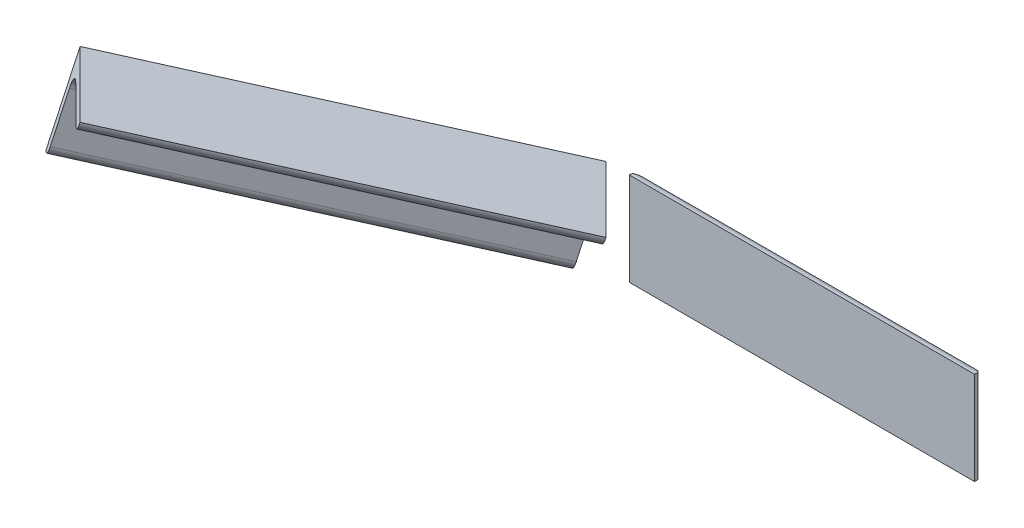
ISO-10303-21;
HEADER;
FILE_DESCRIPTION(('STEP AP214'),'2;1');
FILE_NAME('part.step','',(''),(''),'','','');
FILE_SCHEMA(('AUTOMOTIVE_DESIGN { 1 0 10303 214 1 1 1 1 }'));
ENDSEC;
DATA;
#1=APPLICATION_CONTEXT('core data for automotive mechanical design processes');
#2=APPLICATION_PROTOCOL_DEFINITION('international standard','automotive_design',2000,#1);
#3=PRODUCT_CONTEXT('',#1,'mechanical');
#4=PRODUCT('Part','Part','',(#3));
#5=PRODUCT_RELATED_PRODUCT_CATEGORY('part','',(#4));
#6=PRODUCT_DEFINITION_FORMATION('','',#4);
#7=PRODUCT_DEFINITION_CONTEXT('part definition',#1,'design');
#8=PRODUCT_DEFINITION('design','',#6,#7);
#9=PRODUCT_DEFINITION_SHAPE('','',#8);
#10=(LENGTH_UNIT() NAMED_UNIT(*) SI_UNIT(.MILLI.,.METRE.));
#11=(NAMED_UNIT(*) PLANE_ANGLE_UNIT() SI_UNIT($,.RADIAN.));
#12=(NAMED_UNIT(*) SI_UNIT($,.STERADIAN.) SOLID_ANGLE_UNIT());
#13=UNCERTAINTY_MEASURE_WITH_UNIT(LENGTH_MEASURE(1.E-05),#10,'distance_accuracy_value','');
#14=(GEOMETRIC_REPRESENTATION_CONTEXT(3) GLOBAL_UNCERTAINTY_ASSIGNED_CONTEXT((#13)) GLOBAL_UNIT_ASSIGNED_CONTEXT((#10,
#11,#12)) REPRESENTATION_CONTEXT('',''));
#15=CARTESIAN_POINT('',(0.,0.,0.));
#16=DIRECTION('',(0.,0.,1.));
#17=DIRECTION('',(1.,0.,0.));
#18=AXIS2_PLACEMENT_3D('',#15,#16,#17);
#19=CARTESIAN_POINT('',(-76.4905715966155,28.0891219632598,76.4905715966157));
#20=DIRECTION('',(0.707106781186549,0.,0.707106781186546));
#21=DIRECTION('',(0.707106781186546,0.,-0.707106781186549));
#22=AXIS2_PLACEMENT_3D('',#19,#20,#21);
#23=PLANE('',#22);
#24=DIRECTION('',(-0.183012701892219,-0.965925826289068,0.18301270189222));
#25=VECTOR('',#24,1.);
#26=CARTESIAN_POINT('',(-4.64852262806237,0.865484012257667,4.64852262806239));
#27=LINE('',#26,#25);
#28=CARTESIAN_POINT('',(0.,25.4,0.));
#29=VERTEX_POINT('',#28);
#30=CARTESIAN_POINT('',(-4.64852262806237,0.865484012257667,4.64852262806239));
#31=VERTEX_POINT('',#30);
#32=EDGE_CURVE('E205',#29,#31,#27,.T.);
#33=ORIENTED_EDGE('',*,*,#32,.T.);
#34=DIRECTION('',(0.683012701892218,-0.258819045102521,-0.683012701892221));
#35=VECTOR('',#34,1.);
#36=CARTESIAN_POINT('',(-76.4905715966155,28.0891219632598,76.4905715966157));
#37=LINE('',#36,#35);
#38=CARTESIAN_POINT('',(-76.4905715966155,28.0891219632598,76.4905715966157));
#39=VERTEX_POINT('',#38);
#40=EDGE_CURVE('E14',#39,#31,#37,.T.);
#41=ORIENTED_EDGE('',*,*,#40,.F.);
#42=DIRECTION('',(-0.183012701892219,-0.965925826289068,0.18301270189222));
#43=VECTOR('',#42,1.);
#44=CARTESIAN_POINT('',(-76.4905715966155,28.0891219632598,76.4905715966157));
#45=LINE('',#44,#43);
#46=CARTESIAN_POINT('',(-71.8420489685531,52.6236379510021,71.8420489685534));
#47=VERTEX_POINT('',#46);
#48=EDGE_CURVE('E221',#47,#39,#45,.T.);
#49=ORIENTED_EDGE('',*,*,#48,.F.);
#50=DIRECTION('',(0.683012701892218,-0.258819045102521,-0.683012701892221));
#51=VECTOR('',#50,1.);
#52=CARTESIAN_POINT('',(-71.8420489685531,52.6236379510021,71.8420489685534));
#53=LINE('',#52,#51);
#54=EDGE_CURVE('E201',#47,#29,#53,.T.);
#55=ORIENTED_EDGE('',*,*,#54,.T.);
#56=EDGE_LOOP('',(#33,#41,#49,#55));
#57=FACE_BOUND('',#56,.T.);
#58=ADVANCED_FACE('F103',(#57),#23,.F.);
#59=CARTESIAN_POINT('',(-76.486979494167,28.0891219632598,76.4941636990642));
#60=DIRECTION('',(0.18301270189222,0.965925826289068,-0.18301270189222));
#61=DIRECTION('',(0.,0.186156787897386,0.982520050848698));
#62=AXIS2_PLACEMENT_3D('',#59,#60,#61);
#63=PLANE('',#62);
#64=DIRECTION('',(0.707106781186548,0.,0.707106781186548));
#65=VECTOR('',#64,1.);
#66=CARTESIAN_POINT('',(-4.64493052561394,0.865484012257667,4.65211473051081));
#67=LINE('',#66,#65);
#68=CARTESIAN_POINT('',(-4.64493052561394,0.865484012257669,4.65211473051081));
#69=VERTEX_POINT('',#68);
#70=EDGE_CURVE('E208',#31,#69,#67,.T.);
#71=ORIENTED_EDGE('',*,*,#70,.T.);
#72=DIRECTION('',(0.683012701892218,-0.258819045102521,-0.683012701892221));
#73=VECTOR('',#72,1.);
#74=CARTESIAN_POINT('',(-76.486979494167,28.0891219632598,76.4941636990642));
#75=LINE('',#74,#73);
#76=CARTESIAN_POINT('',(-76.486979494167,28.0891219632598,76.4941636990642));
#77=VERTEX_POINT('',#76);
#78=EDGE_CURVE('E111',#77,#69,#75,.T.);
#79=ORIENTED_EDGE('',*,*,#78,.F.);
#80=DIRECTION('',(0.707106781186548,0.,0.707106781186548));
#81=VECTOR('',#80,1.);
#82=CARTESIAN_POINT('',(-76.486979494167,28.0891219632598,76.4941636990642));
#83=LINE('',#82,#81);
#84=EDGE_CURVE('E165',#39,#77,#83,.T.);
#85=ORIENTED_EDGE('',*,*,#84,.F.);
#86=ORIENTED_EDGE('',*,*,#40,.T.);
#87=EDGE_LOOP('',(#71,#79,#85,#86));
#88=FACE_BOUND('',#87,.T.);
#89=ADVANCED_FACE('F264',(#88),#63,.F.);
#90=CARTESIAN_POINT('',(-75.9068438701849,31.15102955853,75.914028075082));
#91=DIRECTION('',(0.683012701892218,-0.258819045102521,-0.683012701892221));
#92=DIRECTION('',(-0.707106781186549,0.,-0.707106781186546));
#93=AXIS2_PLACEMENT_3D('',#90,#91,#92);
#94=CYLINDRICAL_SURFACE('',#93,3.16992);
#95=CARTESIAN_POINT('',(-4.06479490163176,3.92739160752791,4.07197910652863));
#96=DIRECTION('',(-0.683012701892218,0.258819045102521,0.683012701892221));
#97=DIRECTION('',(0.707106781186549,0.,0.707106781186546));
#98=AXIS2_PLACEMENT_3D('',#95,#96,#97);
#99=CIRCLE('',#98,3.16992);
#100=CARTESIAN_POINT('',(-1.8233229738129,3.92739160752791,6.31345103434748));
#101=VERTEX_POINT('',#100);
#102=EDGE_CURVE('E210',#69,#101,#99,.T.);
#103=ORIENTED_EDGE('',*,*,#102,.T.);
#104=DIRECTION('',(0.683012701892218,-0.258819045102521,-0.683012701892221));
#105=VECTOR('',#104,1.);
#106=CARTESIAN_POINT('',(-73.665371942366,31.15102955853,78.1555000029008));
#107=LINE('',#106,#105);
#108=CARTESIAN_POINT('',(-73.665371942366,31.15102955853,78.1555000029008));
#109=VERTEX_POINT('',#108);
#110=EDGE_CURVE('E231',#109,#101,#107,.T.);
#111=ORIENTED_EDGE('',*,*,#110,.F.);
#112=CARTESIAN_POINT('',(-75.9068438701849,31.15102955853,75.914028075082));
#113=DIRECTION('',(-0.683012701892218,0.258819045102521,0.683012701892221));
#114=DIRECTION('',(0.707106781186549,0.,0.707106781186546));
#115=AXIS2_PLACEMENT_3D('',#112,#113,#114);
#116=CIRCLE('',#115,3.16992);
#117=EDGE_CURVE('E239',#77,#109,#116,.T.);
#118=ORIENTED_EDGE('',*,*,#117,.F.);
#119=ORIENTED_EDGE('',*,*,#78,.T.);
#120=EDGE_LOOP('',(#103,#111,#118,#119));
#121=FACE_BOUND('',#120,.T.);
#122=ADVANCED_FACE('F237',(#121),#94,.T.);
#123=CARTESIAN_POINT('',(-71.0496482595553,44.9566017048326,75.5397763200901));
#124=DIRECTION('',(-0.707106781186549,0.,-0.707106781186546));
#125=DIRECTION('',(-0.707106781186546,0.,0.707106781186549));
#126=AXIS2_PLACEMENT_3D('',#123,#124,#125);
#127=PLANE('',#126);
#128=DIRECTION('',(0.183012701892219,0.965925826289068,-0.18301270189222));
#129=VECTOR('',#128,1.);
#130=CARTESIAN_POINT('',(0.792400708997793,17.7329637538305,3.69772735153678));
#131=LINE('',#130,#129);
#132=CARTESIAN_POINT('',(0.792400708997794,17.7329637538305,3.69772735153678));
#133=VERTEX_POINT('',#132);
#134=EDGE_CURVE('E212',#101,#133,#131,.T.);
#135=ORIENTED_EDGE('',*,*,#134,.T.);
#136=DIRECTION('',(0.683012701892218,-0.258819045102521,-0.683012701892221));
#137=VECTOR('',#136,1.);
#138=CARTESIAN_POINT('',(-71.0496482595553,44.9566017048326,75.5397763200901));
#139=LINE('',#138,#137);
#140=CARTESIAN_POINT('',(-71.0496482595553,44.9566017048326,75.5397763200901));
#141=VERTEX_POINT('',#140);
#142=EDGE_CURVE('E228',#141,#133,#139,.T.);
#143=ORIENTED_EDGE('',*,*,#142,.F.);
#144=DIRECTION('',(0.183012701892219,0.965925826289068,-0.18301270189222));
#145=VECTOR('',#144,1.);
#146=CARTESIAN_POINT('',(-71.0496482595553,44.9566017048326,75.5397763200901));
#147=LINE('',#146,#145);
#148=EDGE_CURVE('E255',#109,#141,#147,.T.);
#149=ORIENTED_EDGE('',*,*,#148,.F.);
#150=ORIENTED_EDGE('',*,*,#110,.T.);
#151=EDGE_LOOP('',(#135,#143,#149,#150));
#152=FACE_BOUND('',#151,.T.);
#153=ADVANCED_FACE('F248',(#152),#127,.F.);
#154=CARTESIAN_POINT('',(-67.6820522141544,44.9566017048326,78.9073723654911));
#155=DIRECTION('',(0.683012701892218,-0.258819045102521,-0.683012701892221));
#156=DIRECTION('',(-0.707106781186549,0.,-0.707106781186546));
#157=AXIS2_PLACEMENT_3D('',#154,#155,#156);
#158=CYLINDRICAL_SURFACE('',#157,4.7625);
#159=CARTESIAN_POINT('',(4.15999675439873,17.7329637538305,7.06532339693771));
#160=DIRECTION('',(0.683012701892218,-0.258819045102521,-0.683012701892221));
#161=DIRECTION('',(-0.707106781186549,0.,-0.707106781186546));
#162=AXIS2_PLACEMENT_3D('',#159,#160,#161);
#163=CIRCLE('',#162,4.7625);
#164=CARTESIAN_POINT('',(5.03159474716043,22.3331855015322,6.19372540417601));
#165=VERTEX_POINT('',#164);
#166=EDGE_CURVE('E214',#133,#165,#163,.T.);
#167=ORIENTED_EDGE('',*,*,#166,.T.);
#168=DIRECTION('',(0.683012701892218,-0.258819045102521,-0.683012701892221));
#169=VECTOR('',#168,1.);
#170=CARTESIAN_POINT('',(-66.8104542213927,49.5568234525343,78.0357743727294));
#171=LINE('',#170,#169);
#172=CARTESIAN_POINT('',(-66.8104542213927,49.5568234525343,78.0357743727294));
#173=VERTEX_POINT('',#172);
#174=EDGE_CURVE('E225',#173,#165,#171,.T.);
#175=ORIENTED_EDGE('',*,*,#174,.F.);
#176=CARTESIAN_POINT('',(-67.6820522141544,44.9566017048326,78.9073723654911));
#177=DIRECTION('',(0.683012701892218,-0.258819045102521,-0.683012701892221));
#178=DIRECTION('',(-0.707106781186549,0.,-0.707106781186546));
#179=AXIS2_PLACEMENT_3D('',#176,#177,#178);
#180=CIRCLE('',#179,4.7625);
#181=EDGE_CURVE('E254',#141,#173,#180,.T.);
#182=ORIENTED_EDGE('',*,*,#181,.F.);
#183=ORIENTED_EDGE('',*,*,#142,.T.);
#184=EDGE_LOOP('',(#167,#175,#182,#183));
#185=FACE_BOUND('',#184,.T.);
#186=ADVANCED_FACE('F252',(#185),#158,.F.);
#187=CARTESIAN_POINT('',(-56.7040739827414,49.5568234525343,88.1421546113806));
#188=DIRECTION('',(0.183012701892218,0.965925826289068,-0.183012701892221));
#189=DIRECTION('',(0.,0.186156787897387,0.982520050848697));
#190=AXIS2_PLACEMENT_3D('',#187,#188,#189);
#191=PLANE('',#190);
#192=DIRECTION('',(0.707106781186549,0.,0.707106781186546));
#193=VECTOR('',#192,1.);
#194=CARTESIAN_POINT('',(15.1379749858117,22.3331855015322,16.3001056428272));
#195=LINE('',#194,#193);
#196=CARTESIAN_POINT('',(15.1379749858117,22.3331855015322,16.3001056428272));
#197=VERTEX_POINT('',#196);
#198=EDGE_CURVE('E216',#165,#197,#195,.T.);
#199=ORIENTED_EDGE('',*,*,#198,.T.);
#200=DIRECTION('',(0.683012701892218,-0.258819045102521,-0.683012701892221));
#201=VECTOR('',#200,1.);
#202=CARTESIAN_POINT('',(-56.7040739827414,49.5568234525343,88.1421546113806));
#203=LINE('',#202,#201);
#204=CARTESIAN_POINT('',(-56.7040739827414,49.5568234525343,88.1421546113806));
#205=VERTEX_POINT('',#204);
#206=EDGE_CURVE('E196',#205,#197,#203,.T.);
#207=ORIENTED_EDGE('',*,*,#206,.F.);
#208=DIRECTION('',(0.707106781186549,0.,0.707106781186546));
#209=VECTOR('',#208,1.);
#210=CARTESIAN_POINT('',(-56.7040739827414,49.5568234525343,88.1421546113806));
#211=LINE('',#210,#209);
#212=EDGE_CURVE('E187',#173,#205,#211,.T.);
#213=ORIENTED_EDGE('',*,*,#212,.F.);
#214=ORIENTED_EDGE('',*,*,#174,.T.);
#215=EDGE_LOOP('',(#199,#207,#213,#214));
#216=FACE_BOUND('',#215,.T.);
#217=ADVANCED_FACE('F276',(#216),#191,.F.);
#218=CARTESIAN_POINT('',(-56.1239383587592,52.6187310478046,87.5620189873984));
#219=DIRECTION('',(0.683012701892218,-0.258819045102521,-0.683012701892221));
#220=DIRECTION('',(-0.707106781186549,0.,-0.707106781186546));
#221=AXIS2_PLACEMENT_3D('',#218,#219,#220);
#222=CYLINDRICAL_SURFACE('',#221,3.16991999999999);
#223=CARTESIAN_POINT('',(15.7181106097939,25.3950930968025,15.719970018845));
#224=DIRECTION('',(-0.683012701892218,0.258819045102521,0.683012701892221));
#225=DIRECTION('',(-0.707106781186549,0.,-0.707106781186546));
#226=AXIS2_PLACEMENT_3D('',#223,#224,#225);
#227=CIRCLE('',#226,3.16991999999999);
#228=CARTESIAN_POINT('',(17.9595825376127,25.3950930968025,17.9614419466639));
#229=VERTEX_POINT('',#228);
#230=EDGE_CURVE('E195',#197,#229,#227,.T.);
#231=ORIENTED_EDGE('',*,*,#230,.T.);
#232=DIRECTION('',(0.683012701892218,-0.258819045102521,-0.683012701892221));
#233=VECTOR('',#232,1.);
#234=CARTESIAN_POINT('',(-53.8824664309404,52.6187310478046,89.8034909152173));
#235=LINE('',#234,#233);
#236=CARTESIAN_POINT('',(-53.8824664309404,52.6187310478046,89.8034909152173));
#237=VERTEX_POINT('',#236);
#238=EDGE_CURVE('E192',#237,#229,#235,.T.);
#239=ORIENTED_EDGE('',*,*,#238,.F.);
#240=CARTESIAN_POINT('',(-56.1239383587592,52.6187310478046,87.5620189873984));
#241=DIRECTION('',(-0.683012701892218,0.258819045102521,0.683012701892221));
#242=DIRECTION('',(-0.707106781186549,0.,-0.707106781186546));
#243=AXIS2_PLACEMENT_3D('',#240,#241,#242);
#244=CIRCLE('',#243,3.16991999999999);
#245=EDGE_CURVE('E181',#205,#237,#244,.T.);
#246=ORIENTED_EDGE('',*,*,#245,.F.);
#247=ORIENTED_EDGE('',*,*,#206,.T.);
#248=EDGE_LOOP('',(#231,#239,#246,#247));
#249=FACE_BOUND('',#248,.T.);
#250=ADVANCED_FACE('F193',(#249),#222,.T.);
#251=CARTESIAN_POINT('',(-53.8815367264148,52.6236379510021,89.8025612106916));
#252=DIRECTION('',(-0.707106781186549,0.,-0.707106781186546));
#253=DIRECTION('',(-0.707106781186546,0.,0.707106781186549));
#254=AXIS2_PLACEMENT_3D('',#251,#252,#253);
#255=PLANE('',#254);
#256=DIRECTION('',(0.183012701892123,0.965925826289104,-0.183012701892123));
#257=VECTOR('',#256,1.);
#258=CARTESIAN_POINT('',(17.9605122421383,25.4,17.9605122421383));
#259=LINE('',#258,#257);
#260=CARTESIAN_POINT('',(17.9605122421383,25.4,17.9605122421383));
#261=VERTEX_POINT('',#260);
#262=EDGE_CURVE('E151',#229,#261,#259,.T.);
#263=ORIENTED_EDGE('',*,*,#262,.T.);
#264=DIRECTION('',(0.683012701892218,-0.258819045102521,-0.683012701892221));
#265=VECTOR('',#264,1.);
#266=CARTESIAN_POINT('',(-53.8815367264148,52.6236379510021,89.8025612106916));
#267=LINE('',#266,#265);
#268=CARTESIAN_POINT('',(-53.8815367264148,52.6236379510021,89.8025612106916));
#269=VERTEX_POINT('',#268);
#270=EDGE_CURVE('E197',#269,#261,#267,.T.);
#271=ORIENTED_EDGE('',*,*,#270,.F.);
#272=DIRECTION('',(0.183012701892123,0.965925826289104,-0.183012701892123));
#273=VECTOR('',#272,1.);
#274=CARTESIAN_POINT('',(-53.8815367264148,52.6236379510021,89.8025612106916));
#275=LINE('',#274,#273);
#276=EDGE_CURVE('E185',#237,#269,#275,.T.);
#277=ORIENTED_EDGE('',*,*,#276,.F.);
#278=ORIENTED_EDGE('',*,*,#238,.T.);
#279=EDGE_LOOP('',(#263,#271,#277,#278));
#280=FACE_BOUND('',#279,.T.);
#281=ADVANCED_FACE('F199',(#280),#255,.F.);
#282=CARTESIAN_POINT('',(-71.8420489685531,52.6236379510021,71.8420489685534));
#283=DIRECTION('',(-0.183012701892219,-0.965925826289068,0.18301270189222));
#284=DIRECTION('',(0.,-0.186156787897386,-0.982520050848698));
#285=AXIS2_PLACEMENT_3D('',#282,#283,#284);
#286=PLANE('',#285);
#287=DIRECTION('',(-0.707106781186549,0.,-0.707106781186546));
#288=VECTOR('',#287,1.);
#289=CARTESIAN_POINT('',(0.,25.4,0.));
#290=LINE('',#289,#288);
#291=EDGE_CURVE('E157',#261,#29,#290,.T.);
#292=ORIENTED_EDGE('',*,*,#291,.T.);
#293=ORIENTED_EDGE('',*,*,#54,.F.);
#294=DIRECTION('',(-0.707106781186549,0.,-0.707106781186546));
#295=VECTOR('',#294,1.);
#296=CARTESIAN_POINT('',(-71.8420489685531,52.6236379510021,71.8420489685534));
#297=LINE('',#296,#295);
#298=EDGE_CURVE('E119',#269,#47,#297,.T.);
#299=ORIENTED_EDGE('',*,*,#298,.F.);
#300=ORIENTED_EDGE('',*,*,#270,.T.);
#301=EDGE_LOOP('',(#292,#293,#299,#300));
#302=FACE_BOUND('',#301,.T.);
#303=ADVANCED_FACE('F284',(#302),#286,.F.);
#304=CARTESIAN_POINT('',(-56.1239383587592,52.6187310478046,87.5620189873984));
#305=DIRECTION('',(0.683012701892218,-0.258819045102521,-0.683012701892221));
#306=DIRECTION('',(-0.707106781186549,0.,-0.707106781186546));
#307=AXIS2_PLACEMENT_3D('',#304,#305,#306);
#308=PLANE('',#307);
#309=ORIENTED_EDGE('',*,*,#48,.T.);
#310=ORIENTED_EDGE('',*,*,#84,.T.);
#311=ORIENTED_EDGE('',*,*,#117,.T.);
#312=ORIENTED_EDGE('',*,*,#148,.T.);
#313=ORIENTED_EDGE('',*,*,#181,.T.);
#314=ORIENTED_EDGE('',*,*,#212,.T.);
#315=ORIENTED_EDGE('',*,*,#245,.T.);
#316=ORIENTED_EDGE('',*,*,#276,.T.);
#317=ORIENTED_EDGE('',*,*,#298,.T.);
#318=EDGE_LOOP('',(#309,#310,#311,#312,#313,#314,#315,#316,#317));
#319=FACE_BOUND('',#318,.T.);
#320=ADVANCED_FACE('F183',(#319),#308,.F.);
#321=CARTESIAN_POINT('',(15.7181106097939,25.3950930968025,15.719970018845));
#322=DIRECTION('',(0.683012701892218,-0.258819045102521,-0.683012701892221));
#323=DIRECTION('',(-0.707106781186549,0.,-0.707106781186546));
#324=AXIS2_PLACEMENT_3D('',#321,#322,#323);
#325=PLANE('',#324);
#326=ORIENTED_EDGE('',*,*,#32,.F.);
#327=ORIENTED_EDGE('',*,*,#291,.F.);
#328=ORIENTED_EDGE('',*,*,#262,.F.);
#329=ORIENTED_EDGE('',*,*,#230,.F.);
#330=ORIENTED_EDGE('',*,*,#198,.F.);
#331=ORIENTED_EDGE('',*,*,#166,.F.);
#332=ORIENTED_EDGE('',*,*,#134,.F.);
#333=ORIENTED_EDGE('',*,*,#102,.F.);
#334=ORIENTED_EDGE('',*,*,#70,.F.);
#335=EDGE_LOOP('',(#326,#327,#328,#329,#330,#331,#332,#333,#334));
#336=FACE_BOUND('',#335,.T.);
#337=ADVANCED_FACE('F243',(#336),#325,.T.);
#338=CLOSED_SHELL('',(#58,#89,#122,#153,#186,#217,#250,#281,#303,#320,#337));
#339=MANIFOLD_SOLID_BREP('B2',#338);
#340=CARTESIAN_POINT('',(100.642689271226,0.,-25.4));
#341=DIRECTION('',(0.,1.,0.));
#342=DIRECTION('',(0.,0.,1.));
#343=AXIS2_PLACEMENT_3D('',#340,#341,#342);
#344=PLANE('',#343);
#345=DIRECTION('',(-1.,0.,0.));
#346=VECTOR('',#345,1.);
#347=CARTESIAN_POINT('',(100.642689271226,0.,-25.4));
#348=LINE('',#347,#346);
#349=CARTESIAN_POINT('',(76.2045355985849,0.,-25.4));
#350=VERTEX_POINT('',#349);
#351=CARTESIAN_POINT('',(30.7881536726414,0.,-25.4));
#352=VERTEX_POINT('',#351);
#353=EDGE_CURVE('E473',#350,#352,#348,.T.);
#354=ORIENTED_EDGE('',*,*,#353,.F.);
#355=DIRECTION('',(-0.707106781186546,0.,-0.707106781186549));
#356=VECTOR('',#355,1.);
#357=CARTESIAN_POINT('',(104.298612434906,0.,2.69407683632074));
#358=LINE('',#357,#356);
#359=CARTESIAN_POINT('',(100.642689271226,0.,-0.961846327358522));
#360=VERTEX_POINT('',#359);
#361=EDGE_CURVE('E459',#360,#350,#358,.T.);
#362=ORIENTED_EDGE('',*,*,#361,.F.);
#363=DIRECTION('',(0.,0.,-1.));
#364=VECTOR('',#363,1.);
#365=CARTESIAN_POINT('',(100.642689271226,0.,-25.4));
#366=LINE('',#365,#364);
#367=CARTESIAN_POINT('',(100.642689271226,0.,0.));
#368=VERTEX_POINT('',#367);
#369=EDGE_CURVE('E500',#368,#360,#366,.T.);
#370=ORIENTED_EDGE('',*,*,#369,.F.);
#371=DIRECTION('',(-1.,0.,0.));
#372=VECTOR('',#371,1.);
#373=CARTESIAN_POINT('',(100.642689271226,0.,0.));
#374=LINE('',#373,#372);
#375=CARTESIAN_POINT('',(6.35,0.,0.));
#376=VERTEX_POINT('',#375);
#377=EDGE_CURVE('E494',#368,#376,#374,.T.);
#378=ORIENTED_EDGE('',*,*,#377,.T.);
#379=DIRECTION('',(0.,0.,-1.));
#380=VECTOR('',#379,1.);
#381=CARTESIAN_POINT('',(6.35,0.,-25.4));
#382=LINE('',#381,#380);
#383=CARTESIAN_POINT('',(6.35,0.,-0.961846327358521));
#384=VERTEX_POINT('',#383);
#385=EDGE_CURVE('E505',#376,#384,#382,.T.);
#386=ORIENTED_EDGE('',*,*,#385,.T.);
#387=DIRECTION('',(0.707106781186546,0.,-0.707106781186549));
#388=VECTOR('',#387,1.);
#389=CARTESIAN_POINT('',(2.69407683632075,0.,2.69407683632074));
#390=LINE('',#389,#388);
#391=EDGE_CURVE('E400',#384,#352,#390,.T.);
#392=ORIENTED_EDGE('',*,*,#391,.T.);
#393=EDGE_LOOP('',(#354,#362,#370,#378,#386,#392));
#394=FACE_BOUND('',#393,.T.);
#395=ADVANCED_FACE('F379',(#394),#344,.F.);
#396=CARTESIAN_POINT('',(100.642689271226,0.00508,-25.4));
#397=DIRECTION('',(0.,0.,1.));
#398=DIRECTION('',(1.,0.,0.));
#399=AXIS2_PLACEMENT_3D('',#396,#397,#398);
#400=PLANE('',#399);
#401=DIRECTION('',(-1.,0.,0.));
#402=VECTOR('',#401,1.);
#403=CARTESIAN_POINT('',(100.642689271226,0.00508,-25.4));
#404=LINE('',#403,#402);
#405=CARTESIAN_POINT('',(76.2045355985849,0.00508000000000799,-25.4));
#406=VERTEX_POINT('',#405);
#407=CARTESIAN_POINT('',(30.7881536726414,0.00508000000000799,-25.4));
#408=VERTEX_POINT('',#407);
#409=EDGE_CURVE('E474',#406,#408,#404,.T.);
#410=ORIENTED_EDGE('',*,*,#409,.F.);
#411=DIRECTION('',(0.,-1.,0.));
#412=VECTOR('',#411,1.);
#413=CARTESIAN_POINT('',(76.2045355985849,25.4,-25.4));
#414=LINE('',#413,#412);
#415=EDGE_CURVE('E462',#406,#350,#414,.T.);
#416=ORIENTED_EDGE('',*,*,#415,.T.);
#417=ORIENTED_EDGE('',*,*,#353,.T.);
#418=DIRECTION('',(0.,-1.,0.));
#419=VECTOR('',#418,1.);
#420=CARTESIAN_POINT('',(30.7881536726414,25.4,-25.4));
#421=LINE('',#420,#419);
#422=EDGE_CURVE('E528',#408,#352,#421,.T.);
#423=ORIENTED_EDGE('',*,*,#422,.F.);
#424=EDGE_LOOP('',(#410,#416,#417,#423));
#425=FACE_BOUND('',#424,.T.);
#426=ADVANCED_FACE('F471',(#425),#400,.F.);
#427=CARTESIAN_POINT('',(100.642689271226,0.00507999999999961,-22.23008));
#428=DIRECTION('',(-1.,0.,0.));
#429=DIRECTION('',(0.,0.,1.));
#430=AXIS2_PLACEMENT_3D('',#427,#428,#429);
#431=CYLINDRICAL_SURFACE('',#430,3.16992);
#432=DIRECTION('',(-1.,0.,0.));
#433=VECTOR('',#432,1.);
#434=CARTESIAN_POINT('',(100.642689271226,3.17499999999999,-22.23008));
#435=LINE('',#434,#433);
#436=CARTESIAN_POINT('',(79.3744555985849,3.17499999999999,-22.23008));
#437=VERTEX_POINT('',#436);
#438=CARTESIAN_POINT('',(27.6182336726414,3.17499999999999,-22.23008));
#439=VERTEX_POINT('',#438);
#440=EDGE_CURVE('E478',#437,#439,#435,.T.);
#441=ORIENTED_EDGE('',*,*,#440,.F.);
#442=CARTESIAN_POINT('',(79.3744555985849,0.00507999999999961,-22.23008));
#443=DIRECTION('',(-0.707106781186549,0.,0.707106781186546));
#444=DIRECTION('',(-0.707106781186546,0.,-0.707106781186549));
#445=AXIS2_PLACEMENT_3D('',#442,#443,#444);
#446=ELLIPSE('',#445,4.48294385563771,3.16992);
#447=EDGE_CURVE('E531',#437,#406,#446,.T.);
#448=ORIENTED_EDGE('',*,*,#447,.T.);
#449=ORIENTED_EDGE('',*,*,#409,.T.);
#450=CARTESIAN_POINT('',(27.6182336726414,0.00507999999999961,-22.23008));
#451=DIRECTION('',(-0.707106781186549,0.,-0.707106781186546));
#452=DIRECTION('',(-0.707106781186546,0.,0.707106781186549));
#453=AXIS2_PLACEMENT_3D('',#450,#451,#452);
#454=ELLIPSE('',#453,4.48294385563771,3.16992);
#455=EDGE_CURVE('E507',#439,#408,#454,.T.);
#456=ORIENTED_EDGE('',*,*,#455,.F.);
#457=EDGE_LOOP('',(#441,#448,#449,#456));
#458=FACE_BOUND('',#457,.T.);
#459=ADVANCED_FACE('F563',(#458),#431,.T.);
#460=CARTESIAN_POINT('',(100.642689271226,3.17499999999999,-7.93750000000001));
#461=DIRECTION('',(0.,-1.,0.));
#462=DIRECTION('',(0.,0.,-1.));
#463=AXIS2_PLACEMENT_3D('',#460,#461,#462);
#464=PLANE('',#463);
#465=DIRECTION('',(-1.,0.,0.));
#466=VECTOR('',#465,1.);
#467=CARTESIAN_POINT('',(100.642689271226,3.17499999999999,-7.93750000000002));
#468=LINE('',#467,#466);
#469=CARTESIAN_POINT('',(93.6670355985848,3.17499999999999,-7.93750000000002));
#470=VERTEX_POINT('',#469);
#471=CARTESIAN_POINT('',(13.3256536726415,3.17499999999999,-7.93750000000002));
#472=VERTEX_POINT('',#471);
#473=EDGE_CURVE('E482',#470,#472,#468,.T.);
#474=ORIENTED_EDGE('',*,*,#473,.F.);
#475=DIRECTION('',(-0.707106781186546,0.,-0.707106781186549));
#476=VECTOR('',#475,1.);
#477=CARTESIAN_POINT('',(97.1548624349055,3.17499999999999,-4.44967316367929));
#478=LINE('',#477,#476);
#479=EDGE_CURVE('E533',#470,#437,#478,.T.);
#480=ORIENTED_EDGE('',*,*,#479,.T.);
#481=ORIENTED_EDGE('',*,*,#440,.T.);
#482=DIRECTION('',(0.707106781186546,0.,-0.707106781186549));
#483=VECTOR('',#482,1.);
#484=CARTESIAN_POINT('',(56.9841714719337,3.175,-51.5960177992924));
#485=LINE('',#484,#483);
#486=EDGE_CURVE('E516',#472,#439,#485,.T.);
#487=ORIENTED_EDGE('',*,*,#486,.F.);
#488=EDGE_LOOP('',(#474,#480,#481,#487));
#489=FACE_BOUND('',#488,.T.);
#490=ADVANCED_FACE('F559',(#489),#464,.F.);
#491=CARTESIAN_POINT('',(100.642689271226,7.93749999999999,-7.93750000000001));
#492=DIRECTION('',(-1.,0.,0.));
#493=DIRECTION('',(0.,0.,1.));
#494=AXIS2_PLACEMENT_3D('',#491,#492,#493);
#495=CYLINDRICAL_SURFACE('',#494,4.7625);
#496=DIRECTION('',(-1.,0.,0.));
#497=VECTOR('',#496,1.);
#498=CARTESIAN_POINT('',(100.642689271226,7.93749999999999,-3.17500000000001));
#499=LINE('',#498,#497);
#500=CARTESIAN_POINT('',(98.4295355985848,7.93749999999999,-3.17500000000001));
#501=VERTEX_POINT('',#500);
#502=CARTESIAN_POINT('',(8.56315367264148,7.93749999999999,-3.17500000000001));
#503=VERTEX_POINT('',#502);
#504=EDGE_CURVE('E484',#501,#503,#499,.T.);
#505=ORIENTED_EDGE('',*,*,#504,.F.);
#506=CARTESIAN_POINT('',(93.6670355985848,7.93749999999999,-7.93750000000001));
#507=DIRECTION('',(-0.707106781186549,0.,0.707106781186546));
#508=DIRECTION('',(-0.707106781186546,0.,-0.707106781186549));
#509=AXIS2_PLACEMENT_3D('',#506,#507,#508);
#510=ELLIPSE('',#509,6.73519209080185,4.7625);
#511=EDGE_CURVE('E536',#501,#470,#510,.F.);
#512=ORIENTED_EDGE('',*,*,#511,.T.);
#513=ORIENTED_EDGE('',*,*,#473,.T.);
#514=CARTESIAN_POINT('',(13.3256536726415,7.93749999999999,-7.93750000000001));
#515=DIRECTION('',(-0.707106781186549,0.,-0.707106781186546));
#516=DIRECTION('',(-0.707106781186546,0.,0.707106781186549));
#517=AXIS2_PLACEMENT_3D('',#514,#515,#516);
#518=ELLIPSE('',#517,6.73519209080185,4.7625);
#519=EDGE_CURVE('E519',#503,#472,#518,.F.);
#520=ORIENTED_EDGE('',*,*,#519,.F.);
#521=EDGE_LOOP('',(#505,#512,#513,#520));
#522=FACE_BOUND('',#521,.T.);
#523=ADVANCED_FACE('F556',(#522),#495,.F.);
#524=CARTESIAN_POINT('',(100.642689271226,22.23008,-3.17499999999999));
#525=DIRECTION('',(0.,0.,1.));
#526=DIRECTION('',(0.,-1.,0.));
#527=AXIS2_PLACEMENT_3D('',#524,#525,#526);
#528=PLANE('',#527);
#529=DIRECTION('',(-1.,0.,0.));
#530=VECTOR('',#529,1.);
#531=CARTESIAN_POINT('',(100.642689271226,22.23008,-3.17499999999999));
#532=LINE('',#531,#530);
#533=CARTESIAN_POINT('',(98.4295355985848,22.23008,-3.17499999999999));
#534=VERTEX_POINT('',#533);
#535=CARTESIAN_POINT('',(8.56315367264146,22.23008,-3.17499999999999));
#536=VERTEX_POINT('',#535);
#537=EDGE_CURVE('E486',#534,#536,#532,.T.);
#538=ORIENTED_EDGE('',*,*,#537,.F.);
#539=DIRECTION('',(0.,-1.,0.));
#540=VECTOR('',#539,1.);
#541=CARTESIAN_POINT('',(98.4295355985848,22.23008,-3.17499999999999));
#542=LINE('',#541,#540);
#543=EDGE_CURVE('E539',#534,#501,#542,.T.);
#544=ORIENTED_EDGE('',*,*,#543,.T.);
#545=ORIENTED_EDGE('',*,*,#504,.T.);
#546=DIRECTION('',(0.,-1.,0.));
#547=VECTOR('',#546,1.);
#548=CARTESIAN_POINT('',(8.56315367264146,22.2300799999999,-3.17499999999999));
#549=LINE('',#548,#547);
#550=EDGE_CURVE('E522',#536,#503,#549,.T.);
#551=ORIENTED_EDGE('',*,*,#550,.F.);
#552=EDGE_LOOP('',(#538,#544,#545,#551));
#553=FACE_BOUND('',#552,.T.);
#554=ADVANCED_FACE('F550',(#553),#528,.F.);
#555=CARTESIAN_POINT('',(100.642689271226,22.23008,-0.00508000000000019));
#556=DIRECTION('',(-1.,0.,0.));
#557=DIRECTION('',(0.,0.,1.));
#558=AXIS2_PLACEMENT_3D('',#555,#556,#557);
#559=CYLINDRICAL_SURFACE('',#558,3.16991999999999);
#560=CARTESIAN_POINT('',(100.642689271226,22.23008,-0.00508000000000019));
#561=DIRECTION('',(1.,0.,0.));
#562=DIRECTION('',(0.,0.,1.));
#563=AXIS2_PLACEMENT_3D('',#560,#561,#562);
#564=CIRCLE('',#563,3.16991999999999);
#565=CARTESIAN_POINT('',(100.642689271226,25.2521638838842,-0.961846327358531));
#566=VERTEX_POINT('',#565);
#567=CARTESIAN_POINT('',(100.642689271226,25.4,-0.00508));
#568=VERTEX_POINT('',#567);
#569=EDGE_CURVE('E511',#566,#568,#564,.T.);
#570=ORIENTED_EDGE('',*,*,#569,.F.);
#571=CARTESIAN_POINT('',(101.599455598585,22.23008,-0.00508000000000019));
#572=DIRECTION('',(-0.707106781186549,0.,0.707106781186546));
#573=DIRECTION('',(-0.707106781186546,0.,-0.707106781186549));
#574=AXIS2_PLACEMENT_3D('',#571,#572,#573);
#575=ELLIPSE('',#574,4.4829438556377,3.16991999999999);
#576=EDGE_CURVE('E393',#566,#534,#575,.T.);
#577=ORIENTED_EDGE('',*,*,#576,.T.);
#578=ORIENTED_EDGE('',*,*,#537,.T.);
#579=CARTESIAN_POINT('',(5.39323367264149,22.23008,-0.00508000000000019));
#580=DIRECTION('',(-0.707106781186549,0.,-0.707106781186546));
#581=DIRECTION('',(-0.707106781186546,0.,0.707106781186549));
#582=AXIS2_PLACEMENT_3D('',#579,#580,#581);
#583=ELLIPSE('',#582,4.4829438556377,3.16991999999999);
#584=CARTESIAN_POINT('',(6.35,25.2521638838842,-0.961846327358522));
#585=VERTEX_POINT('',#584);
#586=EDGE_CURVE('E525',#585,#536,#583,.T.);
#587=ORIENTED_EDGE('',*,*,#586,.F.);
#588=CARTESIAN_POINT('',(6.35,22.23008,-0.00508000000000019));
#589=DIRECTION('',(1.,0.,0.));
#590=DIRECTION('',(0.,0.,1.));
#591=AXIS2_PLACEMENT_3D('',#588,#589,#590);
#592=CIRCLE('',#591,3.16991999999999);
#593=CARTESIAN_POINT('',(6.35,25.4,-0.00508));
#594=VERTEX_POINT('',#593);
#595=EDGE_CURVE('E503',#585,#594,#592,.T.);
#596=ORIENTED_EDGE('',*,*,#595,.T.);
#597=DIRECTION('',(-1.,0.,0.));
#598=VECTOR('',#597,1.);
#599=CARTESIAN_POINT('',(100.642689271226,25.4,-0.00508));
#600=LINE('',#599,#598);
#601=EDGE_CURVE('E488',#568,#594,#600,.T.);
#602=ORIENTED_EDGE('',*,*,#601,.F.);
#603=EDGE_LOOP('',(#570,#577,#578,#587,#596,#602));
#604=FACE_BOUND('',#603,.T.);
#605=ADVANCED_FACE('F545',(#604),#559,.T.);
#606=CARTESIAN_POINT('',(6.35,22.23008,-0.00508000000000019));
#607=DIRECTION('',(-1.,0.,0.));
#608=DIRECTION('',(0.,0.,1.));
#609=AXIS2_PLACEMENT_3D('',#606,#607,#608);
#610=PLANE('',#609);
#611=ORIENTED_EDGE('',*,*,#595,.F.);
#612=DIRECTION('',(0.,-1.,0.));
#613=VECTOR('',#612,1.);
#614=CARTESIAN_POINT('',(6.35,22.23008,-0.961846327358522));
#615=LINE('',#614,#613);
#616=EDGE_CURVE('E386',#585,#384,#615,.T.);
#617=ORIENTED_EDGE('',*,*,#616,.T.);
#618=ORIENTED_EDGE('',*,*,#385,.F.);
#619=DIRECTION('',(0.,-1.,0.));
#620=VECTOR('',#619,1.);
#621=CARTESIAN_POINT('',(6.35,0.,0.));
#622=LINE('',#621,#620);
#623=CARTESIAN_POINT('',(6.35,25.4,0.));
#624=VERTEX_POINT('',#623);
#625=EDGE_CURVE('E498',#624,#376,#622,.T.);
#626=ORIENTED_EDGE('',*,*,#625,.F.);
#627=DIRECTION('',(0.,0.,1.));
#628=VECTOR('',#627,1.);
#629=CARTESIAN_POINT('',(6.35,25.4,0.));
#630=LINE('',#629,#628);
#631=EDGE_CURVE('E501',#594,#624,#630,.T.);
#632=ORIENTED_EDGE('',*,*,#631,.F.);
#633=EDGE_LOOP('',(#611,#617,#618,#626,#632));
#634=FACE_BOUND('',#633,.T.);
#635=ADVANCED_FACE('F614',(#634),#610,.T.);
#636=CARTESIAN_POINT('',(100.642689271226,25.4,0.));
#637=DIRECTION('',(0.,-1.,0.));
#638=DIRECTION('',(0.,0.,-1.));
#639=AXIS2_PLACEMENT_3D('',#636,#637,#638);
#640=PLANE('',#639);
#641=ORIENTED_EDGE('',*,*,#631,.T.);
#642=DIRECTION('',(-1.,0.,0.));
#643=VECTOR('',#642,1.);
#644=CARTESIAN_POINT('',(100.642689271226,25.4,0.));
#645=LINE('',#644,#643);
#646=CARTESIAN_POINT('',(100.642689271226,25.4,0.));
#647=VERTEX_POINT('',#646);
#648=EDGE_CURVE('E491',#647,#624,#645,.T.);
#649=ORIENTED_EDGE('',*,*,#648,.F.);
#650=DIRECTION('',(0.,0.,1.));
#651=VECTOR('',#650,1.);
#652=CARTESIAN_POINT('',(100.642689271226,25.4,0.));
#653=LINE('',#652,#651);
#654=EDGE_CURVE('E509',#568,#647,#653,.T.);
#655=ORIENTED_EDGE('',*,*,#654,.F.);
#656=ORIENTED_EDGE('',*,*,#601,.T.);
#657=EDGE_LOOP('',(#641,#649,#655,#656));
#658=FACE_BOUND('',#657,.T.);
#659=ADVANCED_FACE('F654',(#658),#640,.F.);
#660=CARTESIAN_POINT('',(100.642689271226,0.,0.));
#661=DIRECTION('',(0.,0.,-1.));
#662=DIRECTION('',(-1.,0.,0.));
#663=AXIS2_PLACEMENT_3D('',#660,#661,#662);
#664=PLANE('',#663);
#665=ORIENTED_EDGE('',*,*,#625,.T.);
#666=ORIENTED_EDGE('',*,*,#377,.F.);
#667=DIRECTION('',(0.,-1.,0.));
#668=VECTOR('',#667,1.);
#669=CARTESIAN_POINT('',(100.642689271226,0.,0.));
#670=LINE('',#669,#668);
#671=EDGE_CURVE('E497',#647,#368,#670,.T.);
#672=ORIENTED_EDGE('',*,*,#671,.F.);
#673=ORIENTED_EDGE('',*,*,#648,.T.);
#674=EDGE_LOOP('',(#665,#666,#672,#673));
#675=FACE_BOUND('',#674,.T.);
#676=ADVANCED_FACE('F626',(#675),#664,.F.);
#677=CARTESIAN_POINT('',(100.642689271226,22.23008,-0.00508000000000019));
#678=DIRECTION('',(-1.,0.,0.));
#679=DIRECTION('',(0.,0.,1.));
#680=AXIS2_PLACEMENT_3D('',#677,#678,#679);
#681=PLANE('',#680);
#682=ORIENTED_EDGE('',*,*,#369,.T.);
#683=DIRECTION('',(0.,1.,0.));
#684=VECTOR('',#683,1.);
#685=CARTESIAN_POINT('',(100.642689271226,22.23008,-0.961846327358531));
#686=LINE('',#685,#684);
#687=EDGE_CURVE('E101',#360,#566,#686,.T.);
#688=ORIENTED_EDGE('',*,*,#687,.T.);
#689=ORIENTED_EDGE('',*,*,#569,.T.);
#690=ORIENTED_EDGE('',*,*,#654,.T.);
#691=ORIENTED_EDGE('',*,*,#671,.T.);
#692=EDGE_LOOP('',(#682,#688,#689,#690,#691));
#693=FACE_BOUND('',#692,.T.);
#694=ADVANCED_FACE('F621',(#693),#681,.F.);
#695=CARTESIAN_POINT('',(2.69407683632075,25.4,2.69407683632074));
#696=DIRECTION('',(-0.707106781186549,0.,-0.707106781186546));
#697=DIRECTION('',(-0.707106781186546,0.,0.707106781186549));
#698=AXIS2_PLACEMENT_3D('',#695,#696,#697);
#699=PLANE('',#698);
#700=ORIENTED_EDGE('',*,*,#455,.T.);
#701=ORIENTED_EDGE('',*,*,#422,.T.);
#702=ORIENTED_EDGE('',*,*,#391,.F.);
#703=ORIENTED_EDGE('',*,*,#616,.F.);
#704=ORIENTED_EDGE('',*,*,#586,.T.);
#705=ORIENTED_EDGE('',*,*,#550,.T.);
#706=ORIENTED_EDGE('',*,*,#519,.T.);
#707=ORIENTED_EDGE('',*,*,#486,.T.);
#708=EDGE_LOOP('',(#700,#701,#702,#703,#704,#705,#706,#707));
#709=FACE_BOUND('',#708,.T.);
#710=ADVANCED_FACE('F553',(#709),#699,.T.);
#711=CARTESIAN_POINT('',(104.298612434906,25.4,2.69407683632074));
#712=DIRECTION('',(-0.707106781186549,0.,0.707106781186546));
#713=DIRECTION('',(0.707106781186546,0.,0.707106781186549));
#714=AXIS2_PLACEMENT_3D('',#711,#712,#713);
#715=PLANE('',#714);
#716=ORIENTED_EDGE('',*,*,#479,.F.);
#717=ORIENTED_EDGE('',*,*,#511,.F.);
#718=ORIENTED_EDGE('',*,*,#543,.F.);
#719=ORIENTED_EDGE('',*,*,#576,.F.);
#720=ORIENTED_EDGE('',*,*,#687,.F.);
#721=ORIENTED_EDGE('',*,*,#361,.T.);
#722=ORIENTED_EDGE('',*,*,#415,.F.);
#723=ORIENTED_EDGE('',*,*,#447,.F.);
#724=EDGE_LOOP('',(#716,#717,#718,#719,#720,#721,#722,#723));
#725=FACE_BOUND('',#724,.T.);
#726=ADVANCED_FACE('F461',(#725),#715,.F.);
#727=CLOSED_SHELL('',(#395,#426,#459,#490,#523,#554,#605,#635,#659,#676,#694,#710,#726));
#728=MANIFOLD_SOLID_BREP('B8',#727);
#729=ADVANCED_BREP_SHAPE_REPRESENTATION('',(#18,#339,#728),#14);
#730=SHAPE_DEFINITION_REPRESENTATION(#9,#729);
ENDSEC;
END-ISO-10303-21;
